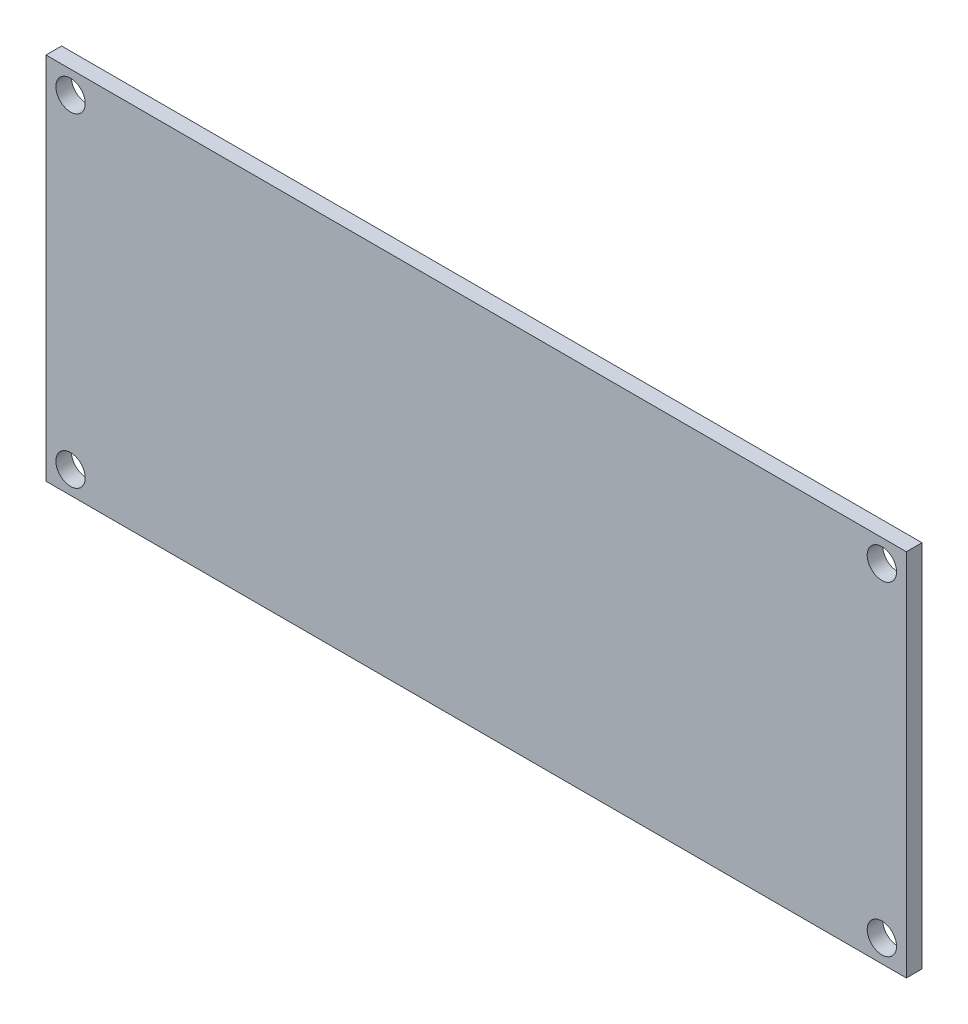
ISO-10303-21;
HEADER;
FILE_DESCRIPTION(('STEP AP214'),'2;1');
FILE_NAME('part.step','',(''),(''),'','','');
FILE_SCHEMA(('AUTOMOTIVE_DESIGN { 1 0 10303 214 1 1 1 1 }'));
ENDSEC;
DATA;
#1=APPLICATION_CONTEXT('core data for automotive mechanical design processes');
#2=APPLICATION_PROTOCOL_DEFINITION('international standard','automotive_design',2000,#1);
#3=PRODUCT_CONTEXT('',#1,'mechanical');
#4=PRODUCT('Part','Part','',(#3));
#5=PRODUCT_RELATED_PRODUCT_CATEGORY('part','',(#4));
#6=PRODUCT_DEFINITION_FORMATION('','',#4);
#7=PRODUCT_DEFINITION_CONTEXT('part definition',#1,'design');
#8=PRODUCT_DEFINITION('design','',#6,#7);
#9=PRODUCT_DEFINITION_SHAPE('','',#8);
#10=(LENGTH_UNIT() NAMED_UNIT(*) SI_UNIT(.MILLI.,.METRE.));
#11=(NAMED_UNIT(*) PLANE_ANGLE_UNIT() SI_UNIT($,.RADIAN.));
#12=(NAMED_UNIT(*) SI_UNIT($,.STERADIAN.) SOLID_ANGLE_UNIT());
#13=UNCERTAINTY_MEASURE_WITH_UNIT(LENGTH_MEASURE(1.E-05),#10,'distance_accuracy_value','');
#14=(GEOMETRIC_REPRESENTATION_CONTEXT(3) GLOBAL_UNCERTAINTY_ASSIGNED_CONTEXT((#13)) GLOBAL_UNIT_ASSIGNED_CONTEXT((#10,
#11,#12)) REPRESENTATION_CONTEXT('',''));
#15=CARTESIAN_POINT('',(0.,0.,0.));
#16=DIRECTION('',(0.,0.,1.));
#17=DIRECTION('',(1.,0.,0.));
#18=AXIS2_PLACEMENT_3D('',#15,#16,#17);
#19=CARTESIAN_POINT('',(0.,0.,1.27));
#20=DIRECTION('',(0.,0.,-1.));
#21=DIRECTION('',(-1.,0.,0.));
#22=AXIS2_PLACEMENT_3D('',#19,#20,#21);
#23=PLANE('',#22);
#24=DIRECTION('',(0.,-1.,0.));
#25=VECTOR('',#24,1.);
#26=CARTESIAN_POINT('',(0.,0.,1.27));
#27=LINE('',#26,#25);
#28=CARTESIAN_POINT('',(0.,30.0482,1.27));
#29=VERTEX_POINT('',#28);
#30=CARTESIAN_POINT('',(0.,0.,1.27));
#31=VERTEX_POINT('',#30);
#32=EDGE_CURVE('E88',#29,#31,#27,.T.);
#33=ORIENTED_EDGE('',*,*,#32,.T.);
#34=DIRECTION('',(1.,0.,0.));
#35=VECTOR('',#34,1.);
#36=CARTESIAN_POINT('',(0.,0.,1.27));
#37=LINE('',#36,#35);
#38=CARTESIAN_POINT('',(70.0278,0.,1.27));
#39=VERTEX_POINT('',#38);
#40=EDGE_CURVE('E83',#31,#39,#37,.T.);
#41=ORIENTED_EDGE('',*,*,#40,.T.);
#42=DIRECTION('',(0.,1.,0.));
#43=VECTOR('',#42,1.);
#44=CARTESIAN_POINT('',(70.0278,0.,1.27));
#45=LINE('',#44,#43);
#46=CARTESIAN_POINT('',(70.0278,30.0482,1.27));
#47=VERTEX_POINT('',#46);
#48=EDGE_CURVE('E86',#39,#47,#45,.T.);
#49=ORIENTED_EDGE('',*,*,#48,.T.);
#50=DIRECTION('',(-1.,0.,0.));
#51=VECTOR('',#50,1.);
#52=CARTESIAN_POINT('',(0.,30.0482,1.27));
#53=LINE('',#52,#51);
#54=EDGE_CURVE('E53',#47,#29,#53,.T.);
#55=ORIENTED_EDGE('',*,*,#54,.T.);
#56=EDGE_LOOP('',(#33,#41,#49,#55));
#57=FACE_BOUND('',#56,.T.);
#58=CARTESIAN_POINT('',(1.9939,28.2194,1.27));
#59=DIRECTION('',(0.,0.,1.));
#60=DIRECTION('',(1.,0.,0.));
#61=AXIS2_PLACEMENT_3D('',#58,#59,#60);
#62=CIRCLE('',#61,1.1938);
#63=CARTESIAN_POINT('',(3.1877,28.2194,1.27));
#64=VERTEX_POINT('',#63);
#65=EDGE_CURVE('E103',#64,#64,#62,.T.);
#66=ORIENTED_EDGE('',*,*,#65,.F.);
#67=EDGE_LOOP('',(#66));
#68=FACE_BOUND('',#67,.T.);
#69=CARTESIAN_POINT('',(68.0339,28.2194,1.27));
#70=DIRECTION('',(0.,0.,1.));
#71=DIRECTION('',(1.,0.,0.));
#72=AXIS2_PLACEMENT_3D('',#69,#70,#71);
#73=CIRCLE('',#72,1.1938);
#74=CARTESIAN_POINT('',(69.2277,28.2194,1.27));
#75=VERTEX_POINT('',#74);
#76=EDGE_CURVE('E118',#75,#75,#73,.T.);
#77=ORIENTED_EDGE('',*,*,#76,.F.);
#78=EDGE_LOOP('',(#77));
#79=FACE_BOUND('',#78,.T.);
#80=CARTESIAN_POINT('',(1.9939,1.8288,1.27));
#81=DIRECTION('',(0.,0.,1.));
#82=DIRECTION('',(1.,0.,0.));
#83=AXIS2_PLACEMENT_3D('',#80,#81,#82);
#84=CIRCLE('',#83,1.1938);
#85=CARTESIAN_POINT('',(3.1877,1.8288,1.27));
#86=VERTEX_POINT('',#85);
#87=EDGE_CURVE('E124',#86,#86,#84,.T.);
#88=ORIENTED_EDGE('',*,*,#87,.F.);
#89=EDGE_LOOP('',(#88));
#90=FACE_BOUND('',#89,.T.);
#91=CARTESIAN_POINT('',(68.0339,1.8288,1.27));
#92=DIRECTION('',(0.,0.,1.));
#93=DIRECTION('',(1.,0.,0.));
#94=AXIS2_PLACEMENT_3D('',#91,#92,#93);
#95=CIRCLE('',#94,1.1938);
#96=CARTESIAN_POINT('',(69.2277,1.8288,1.27));
#97=VERTEX_POINT('',#96);
#98=EDGE_CURVE('E130',#97,#97,#95,.T.);
#99=ORIENTED_EDGE('',*,*,#98,.F.);
#100=EDGE_LOOP('',(#99));
#101=FACE_BOUND('',#100,.T.);
#102=ADVANCED_FACE('F36',(#57,#68,#79,#90,#101),#23,.F.);
#103=CARTESIAN_POINT('',(0.,0.,0.));
#104=DIRECTION('',(0.,0.,-1.));
#105=DIRECTION('',(-1.,0.,0.));
#106=AXIS2_PLACEMENT_3D('',#103,#104,#105);
#107=PLANE('',#106);
#108=CARTESIAN_POINT('',(1.9939,1.8288,0.));
#109=DIRECTION('',(0.,0.,1.));
#110=DIRECTION('',(1.,0.,0.));
#111=AXIS2_PLACEMENT_3D('',#108,#109,#110);
#112=CIRCLE('',#111,1.1938);
#113=CARTESIAN_POINT('',(3.1877,1.8288,0.));
#114=VERTEX_POINT('',#113);
#115=EDGE_CURVE('E127',#114,#114,#112,.T.);
#116=ORIENTED_EDGE('',*,*,#115,.T.);
#117=EDGE_LOOP('',(#116));
#118=FACE_BOUND('',#117,.T.);
#119=CARTESIAN_POINT('',(1.9939,28.2194,0.));
#120=DIRECTION('',(0.,0.,1.));
#121=DIRECTION('',(1.,0.,0.));
#122=AXIS2_PLACEMENT_3D('',#119,#120,#121);
#123=CIRCLE('',#122,1.1938);
#124=CARTESIAN_POINT('',(3.1877,28.2194,0.));
#125=VERTEX_POINT('',#124);
#126=EDGE_CURVE('E115',#125,#125,#123,.T.);
#127=ORIENTED_EDGE('',*,*,#126,.T.);
#128=EDGE_LOOP('',(#127));
#129=FACE_BOUND('',#128,.T.);
#130=DIRECTION('',(0.,-1.,0.));
#131=VECTOR('',#130,1.);
#132=CARTESIAN_POINT('',(0.,0.,0.));
#133=LINE('',#132,#131);
#134=CARTESIAN_POINT('',(0.,30.0482,0.));
#135=VERTEX_POINT('',#134);
#136=CARTESIAN_POINT('',(0.,0.,0.));
#137=VERTEX_POINT('',#136);
#138=EDGE_CURVE('E100',#135,#137,#133,.T.);
#139=ORIENTED_EDGE('',*,*,#138,.F.);
#140=DIRECTION('',(-1.,0.,0.));
#141=VECTOR('',#140,1.);
#142=CARTESIAN_POINT('',(0.,30.0482,0.));
#143=LINE('',#142,#141);
#144=CARTESIAN_POINT('',(70.0278,30.0482,0.));
#145=VERTEX_POINT('',#144);
#146=EDGE_CURVE('E76',#145,#135,#143,.T.);
#147=ORIENTED_EDGE('',*,*,#146,.F.);
#148=DIRECTION('',(0.,1.,0.));
#149=VECTOR('',#148,1.);
#150=CARTESIAN_POINT('',(70.0278,0.,0.));
#151=LINE('',#150,#149);
#152=CARTESIAN_POINT('',(70.0278,0.,0.));
#153=VERTEX_POINT('',#152);
#154=EDGE_CURVE('E70',#153,#145,#151,.T.);
#155=ORIENTED_EDGE('',*,*,#154,.F.);
#156=DIRECTION('',(1.,0.,0.));
#157=VECTOR('',#156,1.);
#158=CARTESIAN_POINT('',(0.,0.,0.));
#159=LINE('',#158,#157);
#160=EDGE_CURVE('E92',#137,#153,#159,.T.);
#161=ORIENTED_EDGE('',*,*,#160,.F.);
#162=EDGE_LOOP('',(#139,#147,#155,#161));
#163=FACE_BOUND('',#162,.T.);
#164=CARTESIAN_POINT('',(68.0339,28.2194,0.));
#165=DIRECTION('',(0.,0.,1.));
#166=DIRECTION('',(1.,0.,0.));
#167=AXIS2_PLACEMENT_3D('',#164,#165,#166);
#168=CIRCLE('',#167,1.1938);
#169=CARTESIAN_POINT('',(69.2277,28.2194,0.));
#170=VERTEX_POINT('',#169);
#171=EDGE_CURVE('E121',#170,#170,#168,.T.);
#172=ORIENTED_EDGE('',*,*,#171,.T.);
#173=EDGE_LOOP('',(#172));
#174=FACE_BOUND('',#173,.T.);
#175=CARTESIAN_POINT('',(68.0339,1.8288,0.));
#176=DIRECTION('',(0.,0.,1.));
#177=DIRECTION('',(1.,0.,0.));
#178=AXIS2_PLACEMENT_3D('',#175,#176,#177);
#179=CIRCLE('',#178,1.1938);
#180=CARTESIAN_POINT('',(69.2277,1.8288,0.));
#181=VERTEX_POINT('',#180);
#182=EDGE_CURVE('E133',#181,#181,#179,.T.);
#183=ORIENTED_EDGE('',*,*,#182,.T.);
#184=EDGE_LOOP('',(#183));
#185=FACE_BOUND('',#184,.T.);
#186=ADVANCED_FACE('F111',(#118,#129,#163,#174,#185),#107,.T.);
#187=CARTESIAN_POINT('',(0.,0.,1.27));
#188=DIRECTION('',(1.,0.,0.));
#189=DIRECTION('',(0.,0.,-1.));
#190=AXIS2_PLACEMENT_3D('',#187,#188,#189);
#191=PLANE('',#190);
#192=ORIENTED_EDGE('',*,*,#138,.T.);
#193=DIRECTION('',(0.,0.,-1.));
#194=VECTOR('',#193,1.);
#195=CARTESIAN_POINT('',(0.,0.,1.27));
#196=LINE('',#195,#194);
#197=EDGE_CURVE('E11',#31,#137,#196,.T.);
#198=ORIENTED_EDGE('',*,*,#197,.F.);
#199=ORIENTED_EDGE('',*,*,#32,.F.);
#200=DIRECTION('',(0.,0.,-1.));
#201=VECTOR('',#200,1.);
#202=CARTESIAN_POINT('',(0.,30.0482,1.27));
#203=LINE('',#202,#201);
#204=EDGE_CURVE('E96',#29,#135,#203,.T.);
#205=ORIENTED_EDGE('',*,*,#204,.T.);
#206=EDGE_LOOP('',(#192,#198,#199,#205));
#207=FACE_BOUND('',#206,.T.);
#208=ADVANCED_FACE('F38',(#207),#191,.F.);
#209=CARTESIAN_POINT('',(0.,0.,1.27));
#210=DIRECTION('',(0.,1.,0.));
#211=DIRECTION('',(0.,0.,1.));
#212=AXIS2_PLACEMENT_3D('',#209,#210,#211);
#213=PLANE('',#212);
#214=ORIENTED_EDGE('',*,*,#160,.T.);
#215=DIRECTION('',(0.,0.,-1.));
#216=VECTOR('',#215,1.);
#217=CARTESIAN_POINT('',(70.0278,0.,1.27));
#218=LINE('',#217,#216);
#219=EDGE_CURVE('E45',#39,#153,#218,.T.);
#220=ORIENTED_EDGE('',*,*,#219,.F.);
#221=ORIENTED_EDGE('',*,*,#40,.F.);
#222=ORIENTED_EDGE('',*,*,#197,.T.);
#223=EDGE_LOOP('',(#214,#220,#221,#222));
#224=FACE_BOUND('',#223,.T.);
#225=ADVANCED_FACE('F91',(#224),#213,.F.);
#226=CARTESIAN_POINT('',(70.0278,0.,1.27));
#227=DIRECTION('',(-1.,0.,0.));
#228=DIRECTION('',(0.,0.,1.));
#229=AXIS2_PLACEMENT_3D('',#226,#227,#228);
#230=PLANE('',#229);
#231=ORIENTED_EDGE('',*,*,#154,.T.);
#232=DIRECTION('',(0.,0.,-1.));
#233=VECTOR('',#232,1.);
#234=CARTESIAN_POINT('',(70.0278,30.0482,1.27));
#235=LINE('',#234,#233);
#236=EDGE_CURVE('E93',#47,#145,#235,.T.);
#237=ORIENTED_EDGE('',*,*,#236,.F.);
#238=ORIENTED_EDGE('',*,*,#48,.F.);
#239=ORIENTED_EDGE('',*,*,#219,.T.);
#240=EDGE_LOOP('',(#231,#237,#238,#239));
#241=FACE_BOUND('',#240,.T.);
#242=ADVANCED_FACE('F94',(#241),#230,.F.);
#243=CARTESIAN_POINT('',(0.,30.0482,1.27));
#244=DIRECTION('',(0.,-1.,0.));
#245=DIRECTION('',(0.,0.,-1.));
#246=AXIS2_PLACEMENT_3D('',#243,#244,#245);
#247=PLANE('',#246);
#248=ORIENTED_EDGE('',*,*,#146,.T.);
#249=ORIENTED_EDGE('',*,*,#204,.F.);
#250=ORIENTED_EDGE('',*,*,#54,.F.);
#251=ORIENTED_EDGE('',*,*,#236,.T.);
#252=EDGE_LOOP('',(#248,#249,#250,#251));
#253=FACE_BOUND('',#252,.T.);
#254=ADVANCED_FACE('F108',(#253),#247,.F.);
#255=CARTESIAN_POINT('',(1.9939,28.2194,1.27));
#256=DIRECTION('',(0.,0.,-1.));
#257=DIRECTION('',(-1.,0.,0.));
#258=AXIS2_PLACEMENT_3D('',#255,#256,#257);
#259=CYLINDRICAL_SURFACE('',#258,1.1938);
#260=ORIENTED_EDGE('',*,*,#65,.T.);
#261=EDGE_LOOP('',(#260));
#262=FACE_BOUND('',#261,.T.);
#263=ORIENTED_EDGE('',*,*,#126,.F.);
#264=EDGE_LOOP('',(#263));
#265=FACE_BOUND('',#264,.T.);
#266=ADVANCED_FACE('F150',(#262,#265),#259,.F.);
#267=CARTESIAN_POINT('',(68.0339,28.2194,1.27));
#268=DIRECTION('',(0.,0.,-1.));
#269=DIRECTION('',(-1.,0.,0.));
#270=AXIS2_PLACEMENT_3D('',#267,#268,#269);
#271=CYLINDRICAL_SURFACE('',#270,1.1938);
#272=ORIENTED_EDGE('',*,*,#76,.T.);
#273=EDGE_LOOP('',(#272));
#274=FACE_BOUND('',#273,.T.);
#275=ORIENTED_EDGE('',*,*,#171,.F.);
#276=EDGE_LOOP('',(#275));
#277=FACE_BOUND('',#276,.T.);
#278=ADVANCED_FACE('F196',(#274,#277),#271,.F.);
#279=CARTESIAN_POINT('',(1.9939,1.8288,1.27));
#280=DIRECTION('',(0.,0.,-1.));
#281=DIRECTION('',(-1.,0.,0.));
#282=AXIS2_PLACEMENT_3D('',#279,#280,#281);
#283=CYLINDRICAL_SURFACE('',#282,1.1938);
#284=ORIENTED_EDGE('',*,*,#87,.T.);
#285=EDGE_LOOP('',(#284));
#286=FACE_BOUND('',#285,.T.);
#287=ORIENTED_EDGE('',*,*,#115,.F.);
#288=EDGE_LOOP('',(#287));
#289=FACE_BOUND('',#288,.T.);
#290=ADVANCED_FACE('F204',(#286,#289),#283,.F.);
#291=CARTESIAN_POINT('',(68.0339,1.8288,1.27));
#292=DIRECTION('',(0.,0.,-1.));
#293=DIRECTION('',(-1.,0.,0.));
#294=AXIS2_PLACEMENT_3D('',#291,#292,#293);
#295=CYLINDRICAL_SURFACE('',#294,1.1938);
#296=ORIENTED_EDGE('',*,*,#98,.T.);
#297=EDGE_LOOP('',(#296));
#298=FACE_BOUND('',#297,.T.);
#299=ORIENTED_EDGE('',*,*,#182,.F.);
#300=EDGE_LOOP('',(#299));
#301=FACE_BOUND('',#300,.T.);
#302=ADVANCED_FACE('F139',(#298,#301),#295,.F.);
#303=CLOSED_SHELL('',(#102,#186,#208,#225,#242,#254,#266,#278,#290,#302));
#304=MANIFOLD_SOLID_BREP('B2',#303);
#305=ADVANCED_BREP_SHAPE_REPRESENTATION('',(#18,#304),#14);
#306=SHAPE_DEFINITION_REPRESENTATION(#9,#305);
ENDSEC;
END-ISO-10303-21;
